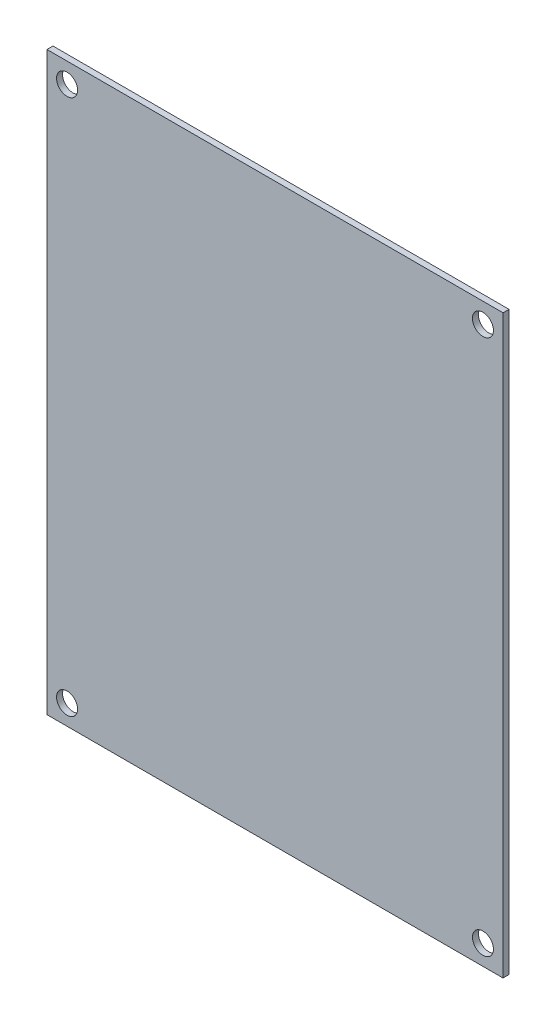
ISO-10303-21;
HEADER;
FILE_DESCRIPTION(('STEP AP214'),'2;1');
FILE_NAME('part.step','',(''),(''),'','','');
FILE_SCHEMA(('AUTOMOTIVE_DESIGN { 1 0 10303 214 1 1 1 1 }'));
ENDSEC;
DATA;
#1=APPLICATION_CONTEXT('core data for automotive mechanical design processes');
#2=APPLICATION_PROTOCOL_DEFINITION('international standard','automotive_design',2000,#1);
#3=PRODUCT_CONTEXT('',#1,'mechanical');
#4=PRODUCT('Part','Part','',(#3));
#5=PRODUCT_RELATED_PRODUCT_CATEGORY('part','',(#4));
#6=PRODUCT_DEFINITION_FORMATION('','',#4);
#7=PRODUCT_DEFINITION_CONTEXT('part definition',#1,'design');
#8=PRODUCT_DEFINITION('design','',#6,#7);
#9=PRODUCT_DEFINITION_SHAPE('','',#8);
#10=(LENGTH_UNIT() NAMED_UNIT(*) SI_UNIT(.MILLI.,.METRE.));
#11=(NAMED_UNIT(*) PLANE_ANGLE_UNIT() SI_UNIT($,.RADIAN.));
#12=(NAMED_UNIT(*) SI_UNIT($,.STERADIAN.) SOLID_ANGLE_UNIT());
#13=UNCERTAINTY_MEASURE_WITH_UNIT(LENGTH_MEASURE(1.E-05),#10,'distance_accuracy_value','');
#14=(GEOMETRIC_REPRESENTATION_CONTEXT(3) GLOBAL_UNCERTAINTY_ASSIGNED_CONTEXT((#13)) GLOBAL_UNIT_ASSIGNED_CONTEXT((#10,
#11,#12)) REPRESENTATION_CONTEXT('',''));
#15=CARTESIAN_POINT('',(0.,0.,0.));
#16=DIRECTION('',(0.,0.,1.));
#17=DIRECTION('',(1.,0.,0.));
#18=AXIS2_PLACEMENT_3D('',#15,#16,#17);
#19=CARTESIAN_POINT('',(0.,0.,1.));
#20=DIRECTION('',(0.,0.,1.));
#21=DIRECTION('',(1.,0.,0.));
#22=AXIS2_PLACEMENT_3D('',#19,#20,#21);
#23=PLANE('',#22);
#24=CARTESIAN_POINT('',(34.6500000000001,-44.65,1.));
#25=DIRECTION('',(0.,0.,1.));
#26=DIRECTION('',(1.,0.,0.));
#27=AXIS2_PLACEMENT_3D('',#24,#25,#26);
#28=CIRCLE('',#27,1.75);
#29=CARTESIAN_POINT('',(36.4000000000001,-44.65,1.));
#30=VERTEX_POINT('',#29);
#31=EDGE_CURVE('E123',#30,#30,#28,.T.);
#32=ORIENTED_EDGE('',*,*,#31,.F.);
#33=EDGE_LOOP('',(#32));
#34=FACE_BOUND('',#33,.T.);
#35=CARTESIAN_POINT('',(-34.65,44.65,1.));
#36=DIRECTION('',(0.,0.,1.));
#37=DIRECTION('',(1.,0.,0.));
#38=AXIS2_PLACEMENT_3D('',#35,#36,#37);
#39=CIRCLE('',#38,1.75);
#40=CARTESIAN_POINT('',(-32.9,44.65,1.));
#41=VERTEX_POINT('',#40);
#42=EDGE_CURVE('E102',#41,#41,#39,.T.);
#43=ORIENTED_EDGE('',*,*,#42,.F.);
#44=EDGE_LOOP('',(#43));
#45=FACE_BOUND('',#44,.T.);
#46=DIRECTION('',(0.,1.,0.));
#47=VECTOR('',#46,1.);
#48=CARTESIAN_POINT('',(38.,48.,1.));
#49=LINE('',#48,#47);
#50=CARTESIAN_POINT('',(38.,-48.,1.));
#51=VERTEX_POINT('',#50);
#52=CARTESIAN_POINT('',(38.,48.,1.));
#53=VERTEX_POINT('',#52);
#54=EDGE_CURVE('E87',#51,#53,#49,.T.);
#55=ORIENTED_EDGE('',*,*,#54,.T.);
#56=DIRECTION('',(-1.,0.,0.));
#57=VECTOR('',#56,1.);
#58=CARTESIAN_POINT('',(-38.,48.,1.));
#59=LINE('',#58,#57);
#60=CARTESIAN_POINT('',(-38.,48.,1.));
#61=VERTEX_POINT('',#60);
#62=EDGE_CURVE('E82',#53,#61,#59,.T.);
#63=ORIENTED_EDGE('',*,*,#62,.T.);
#64=DIRECTION('',(0.,-1.,0.));
#65=VECTOR('',#64,1.);
#66=CARTESIAN_POINT('',(-38.,48.,1.));
#67=LINE('',#66,#65);
#68=CARTESIAN_POINT('',(-38.,-48.,1.));
#69=VERTEX_POINT('',#68);
#70=EDGE_CURVE('E85',#61,#69,#67,.T.);
#71=ORIENTED_EDGE('',*,*,#70,.T.);
#72=DIRECTION('',(1.,0.,0.));
#73=VECTOR('',#72,1.);
#74=CARTESIAN_POINT('',(-38.,-48.,1.));
#75=LINE('',#74,#73);
#76=EDGE_CURVE('E52',#69,#51,#75,.T.);
#77=ORIENTED_EDGE('',*,*,#76,.T.);
#78=EDGE_LOOP('',(#55,#63,#71,#77));
#79=FACE_BOUND('',#78,.T.);
#80=CARTESIAN_POINT('',(34.65,44.65,1.));
#81=DIRECTION('',(0.,0.,1.));
#82=DIRECTION('',(1.,0.,0.));
#83=AXIS2_PLACEMENT_3D('',#80,#81,#82);
#84=CIRCLE('',#83,1.75);
#85=CARTESIAN_POINT('',(36.4,44.65,1.));
#86=VERTEX_POINT('',#85);
#87=EDGE_CURVE('E117',#86,#86,#84,.T.);
#88=ORIENTED_EDGE('',*,*,#87,.F.);
#89=EDGE_LOOP('',(#88));
#90=FACE_BOUND('',#89,.T.);
#91=CARTESIAN_POINT('',(-34.65,-44.65,1.));
#92=DIRECTION('',(0.,0.,1.));
#93=DIRECTION('',(1.,0.,0.));
#94=AXIS2_PLACEMENT_3D('',#91,#92,#93);
#95=CIRCLE('',#94,1.75);
#96=CARTESIAN_POINT('',(-32.9,-44.65,1.));
#97=VERTEX_POINT('',#96);
#98=EDGE_CURVE('E129',#97,#97,#95,.T.);
#99=ORIENTED_EDGE('',*,*,#98,.F.);
#100=EDGE_LOOP('',(#99));
#101=FACE_BOUND('',#100,.T.);
#102=ADVANCED_FACE('F35',(#34,#45,#79,#90,#101),#23,.T.);
#103=CARTESIAN_POINT('',(0.,0.,0.));
#104=DIRECTION('',(0.,0.,1.));
#105=DIRECTION('',(1.,0.,0.));
#106=AXIS2_PLACEMENT_3D('',#103,#104,#105);
#107=PLANE('',#106);
#108=DIRECTION('',(0.,1.,0.));
#109=VECTOR('',#108,1.);
#110=CARTESIAN_POINT('',(38.,48.,0.));
#111=LINE('',#110,#109);
#112=CARTESIAN_POINT('',(38.,-48.,0.));
#113=VERTEX_POINT('',#112);
#114=CARTESIAN_POINT('',(38.,48.,0.));
#115=VERTEX_POINT('',#114);
#116=EDGE_CURVE('E99',#113,#115,#111,.T.);
#117=ORIENTED_EDGE('',*,*,#116,.F.);
#118=DIRECTION('',(1.,0.,0.));
#119=VECTOR('',#118,1.);
#120=CARTESIAN_POINT('',(-38.,-48.,0.));
#121=LINE('',#120,#119);
#122=CARTESIAN_POINT('',(-38.,-48.,0.));
#123=VERTEX_POINT('',#122);
#124=EDGE_CURVE('E75',#123,#113,#121,.T.);
#125=ORIENTED_EDGE('',*,*,#124,.F.);
#126=DIRECTION('',(0.,-1.,0.));
#127=VECTOR('',#126,1.);
#128=CARTESIAN_POINT('',(-38.,48.,0.));
#129=LINE('',#128,#127);
#130=CARTESIAN_POINT('',(-38.,48.,0.));
#131=VERTEX_POINT('',#130);
#132=EDGE_CURVE('E69',#131,#123,#129,.T.);
#133=ORIENTED_EDGE('',*,*,#132,.F.);
#134=DIRECTION('',(-1.,0.,0.));
#135=VECTOR('',#134,1.);
#136=CARTESIAN_POINT('',(-38.,48.,0.));
#137=LINE('',#136,#135);
#138=EDGE_CURVE('E91',#115,#131,#137,.T.);
#139=ORIENTED_EDGE('',*,*,#138,.F.);
#140=EDGE_LOOP('',(#117,#125,#133,#139));
#141=FACE_BOUND('',#140,.T.);
#142=CARTESIAN_POINT('',(-34.65,44.65,0.));
#143=DIRECTION('',(0.,0.,1.));
#144=DIRECTION('',(1.,0.,0.));
#145=AXIS2_PLACEMENT_3D('',#142,#143,#144);
#146=CIRCLE('',#145,1.75);
#147=CARTESIAN_POINT('',(-32.9,44.65,0.));
#148=VERTEX_POINT('',#147);
#149=EDGE_CURVE('E114',#148,#148,#146,.T.);
#150=ORIENTED_EDGE('',*,*,#149,.T.);
#151=EDGE_LOOP('',(#150));
#152=FACE_BOUND('',#151,.T.);
#153=CARTESIAN_POINT('',(34.65,44.65,0.));
#154=DIRECTION('',(0.,0.,1.));
#155=DIRECTION('',(1.,0.,0.));
#156=AXIS2_PLACEMENT_3D('',#153,#154,#155);
#157=CIRCLE('',#156,1.75);
#158=CARTESIAN_POINT('',(36.4,44.65,0.));
#159=VERTEX_POINT('',#158);
#160=EDGE_CURVE('E120',#159,#159,#157,.T.);
#161=ORIENTED_EDGE('',*,*,#160,.T.);
#162=EDGE_LOOP('',(#161));
#163=FACE_BOUND('',#162,.T.);
#164=CARTESIAN_POINT('',(34.6500000000001,-44.65,0.));
#165=DIRECTION('',(0.,0.,1.));
#166=DIRECTION('',(1.,0.,0.));
#167=AXIS2_PLACEMENT_3D('',#164,#165,#166);
#168=CIRCLE('',#167,1.75);
#169=CARTESIAN_POINT('',(36.4000000000001,-44.65,0.));
#170=VERTEX_POINT('',#169);
#171=EDGE_CURVE('E126',#170,#170,#168,.T.);
#172=ORIENTED_EDGE('',*,*,#171,.T.);
#173=EDGE_LOOP('',(#172));
#174=FACE_BOUND('',#173,.T.);
#175=CARTESIAN_POINT('',(-34.65,-44.65,0.));
#176=DIRECTION('',(0.,0.,1.));
#177=DIRECTION('',(1.,0.,0.));
#178=AXIS2_PLACEMENT_3D('',#175,#176,#177);
#179=CIRCLE('',#178,1.75);
#180=CARTESIAN_POINT('',(-32.9,-44.65,0.));
#181=VERTEX_POINT('',#180);
#182=EDGE_CURVE('E132',#181,#181,#179,.T.);
#183=ORIENTED_EDGE('',*,*,#182,.T.);
#184=EDGE_LOOP('',(#183));
#185=FACE_BOUND('',#184,.T.);
#186=ADVANCED_FACE('F110',(#141,#152,#163,#174,#185),#107,.F.);
#187=CARTESIAN_POINT('',(38.,48.,1.));
#188=DIRECTION('',(-1.,0.,0.));
#189=DIRECTION('',(0.,-1.,0.));
#190=AXIS2_PLACEMENT_3D('',#187,#188,#189);
#191=PLANE('',#190);
#192=ORIENTED_EDGE('',*,*,#116,.T.);
#193=DIRECTION('',(0.,0.,-1.));
#194=VECTOR('',#193,1.);
#195=CARTESIAN_POINT('',(38.,48.,1.));
#196=LINE('',#195,#194);
#197=EDGE_CURVE('E11',#53,#115,#196,.T.);
#198=ORIENTED_EDGE('',*,*,#197,.F.);
#199=ORIENTED_EDGE('',*,*,#54,.F.);
#200=DIRECTION('',(0.,0.,-1.));
#201=VECTOR('',#200,1.);
#202=CARTESIAN_POINT('',(38.,-48.,1.));
#203=LINE('',#202,#201);
#204=EDGE_CURVE('E95',#51,#113,#203,.T.);
#205=ORIENTED_EDGE('',*,*,#204,.T.);
#206=EDGE_LOOP('',(#192,#198,#199,#205));
#207=FACE_BOUND('',#206,.T.);
#208=ADVANCED_FACE('F37',(#207),#191,.F.);
#209=CARTESIAN_POINT('',(-38.,48.,1.));
#210=DIRECTION('',(0.,-1.,0.));
#211=DIRECTION('',(0.,0.,-1.));
#212=AXIS2_PLACEMENT_3D('',#209,#210,#211);
#213=PLANE('',#212);
#214=ORIENTED_EDGE('',*,*,#138,.T.);
#215=DIRECTION('',(0.,0.,-1.));
#216=VECTOR('',#215,1.);
#217=CARTESIAN_POINT('',(-38.,48.,1.));
#218=LINE('',#217,#216);
#219=EDGE_CURVE('E44',#61,#131,#218,.T.);
#220=ORIENTED_EDGE('',*,*,#219,.F.);
#221=ORIENTED_EDGE('',*,*,#62,.F.);
#222=ORIENTED_EDGE('',*,*,#197,.T.);
#223=EDGE_LOOP('',(#214,#220,#221,#222));
#224=FACE_BOUND('',#223,.T.);
#225=ADVANCED_FACE('F90',(#224),#213,.F.);
#226=CARTESIAN_POINT('',(-38.,48.,1.));
#227=DIRECTION('',(1.,0.,0.));
#228=DIRECTION('',(0.,1.,0.));
#229=AXIS2_PLACEMENT_3D('',#226,#227,#228);
#230=PLANE('',#229);
#231=ORIENTED_EDGE('',*,*,#132,.T.);
#232=DIRECTION('',(0.,0.,-1.));
#233=VECTOR('',#232,1.);
#234=CARTESIAN_POINT('',(-38.,-48.,1.));
#235=LINE('',#234,#233);
#236=EDGE_CURVE('E92',#69,#123,#235,.T.);
#237=ORIENTED_EDGE('',*,*,#236,.F.);
#238=ORIENTED_EDGE('',*,*,#70,.F.);
#239=ORIENTED_EDGE('',*,*,#219,.T.);
#240=EDGE_LOOP('',(#231,#237,#238,#239));
#241=FACE_BOUND('',#240,.T.);
#242=ADVANCED_FACE('F93',(#241),#230,.F.);
#243=CARTESIAN_POINT('',(-38.,-48.,1.));
#244=DIRECTION('',(0.,1.,0.));
#245=DIRECTION('',(0.,0.,1.));
#246=AXIS2_PLACEMENT_3D('',#243,#244,#245);
#247=PLANE('',#246);
#248=ORIENTED_EDGE('',*,*,#124,.T.);
#249=ORIENTED_EDGE('',*,*,#204,.F.);
#250=ORIENTED_EDGE('',*,*,#76,.F.);
#251=ORIENTED_EDGE('',*,*,#236,.T.);
#252=EDGE_LOOP('',(#248,#249,#250,#251));
#253=FACE_BOUND('',#252,.T.);
#254=ADVANCED_FACE('F107',(#253),#247,.F.);
#255=CARTESIAN_POINT('',(-34.65,44.65,1.));
#256=DIRECTION('',(0.,0.,-1.));
#257=DIRECTION('',(-1.,0.,0.));
#258=AXIS2_PLACEMENT_3D('',#255,#256,#257);
#259=CYLINDRICAL_SURFACE('',#258,1.75);
#260=ORIENTED_EDGE('',*,*,#42,.T.);
#261=EDGE_LOOP('',(#260));
#262=FACE_BOUND('',#261,.T.);
#263=ORIENTED_EDGE('',*,*,#149,.F.);
#264=EDGE_LOOP('',(#263));
#265=FACE_BOUND('',#264,.T.);
#266=ADVANCED_FACE('F151',(#262,#265),#259,.F.);
#267=CARTESIAN_POINT('',(34.65,44.65,1.));
#268=DIRECTION('',(0.,0.,-1.));
#269=DIRECTION('',(-1.,0.,0.));
#270=AXIS2_PLACEMENT_3D('',#267,#268,#269);
#271=CYLINDRICAL_SURFACE('',#270,1.75);
#272=ORIENTED_EDGE('',*,*,#87,.T.);
#273=EDGE_LOOP('',(#272));
#274=FACE_BOUND('',#273,.T.);
#275=ORIENTED_EDGE('',*,*,#160,.F.);
#276=EDGE_LOOP('',(#275));
#277=FACE_BOUND('',#276,.T.);
#278=ADVANCED_FACE('F197',(#274,#277),#271,.F.);
#279=CARTESIAN_POINT('',(34.6500000000001,-44.65,1.));
#280=DIRECTION('',(0.,0.,-1.));
#281=DIRECTION('',(-1.,0.,0.));
#282=AXIS2_PLACEMENT_3D('',#279,#280,#281);
#283=CYLINDRICAL_SURFACE('',#282,1.75);
#284=ORIENTED_EDGE('',*,*,#31,.T.);
#285=EDGE_LOOP('',(#284));
#286=FACE_BOUND('',#285,.T.);
#287=ORIENTED_EDGE('',*,*,#171,.F.);
#288=EDGE_LOOP('',(#287));
#289=FACE_BOUND('',#288,.T.);
#290=ADVANCED_FACE('F205',(#286,#289),#283,.F.);
#291=CARTESIAN_POINT('',(-34.65,-44.65,1.));
#292=DIRECTION('',(0.,0.,-1.));
#293=DIRECTION('',(-1.,0.,0.));
#294=AXIS2_PLACEMENT_3D('',#291,#292,#293);
#295=CYLINDRICAL_SURFACE('',#294,1.75);
#296=ORIENTED_EDGE('',*,*,#98,.T.);
#297=EDGE_LOOP('',(#296));
#298=FACE_BOUND('',#297,.T.);
#299=ORIENTED_EDGE('',*,*,#182,.F.);
#300=EDGE_LOOP('',(#299));
#301=FACE_BOUND('',#300,.T.);
#302=ADVANCED_FACE('F138',(#298,#301),#295,.F.);
#303=CLOSED_SHELL('',(#102,#186,#208,#225,#242,#254,#266,#278,#290,#302));
#304=MANIFOLD_SOLID_BREP('B2',#303);
#305=ADVANCED_BREP_SHAPE_REPRESENTATION('',(#18,#304),#14);
#306=SHAPE_DEFINITION_REPRESENTATION(#9,#305);
ENDSEC;
END-ISO-10303-21;
